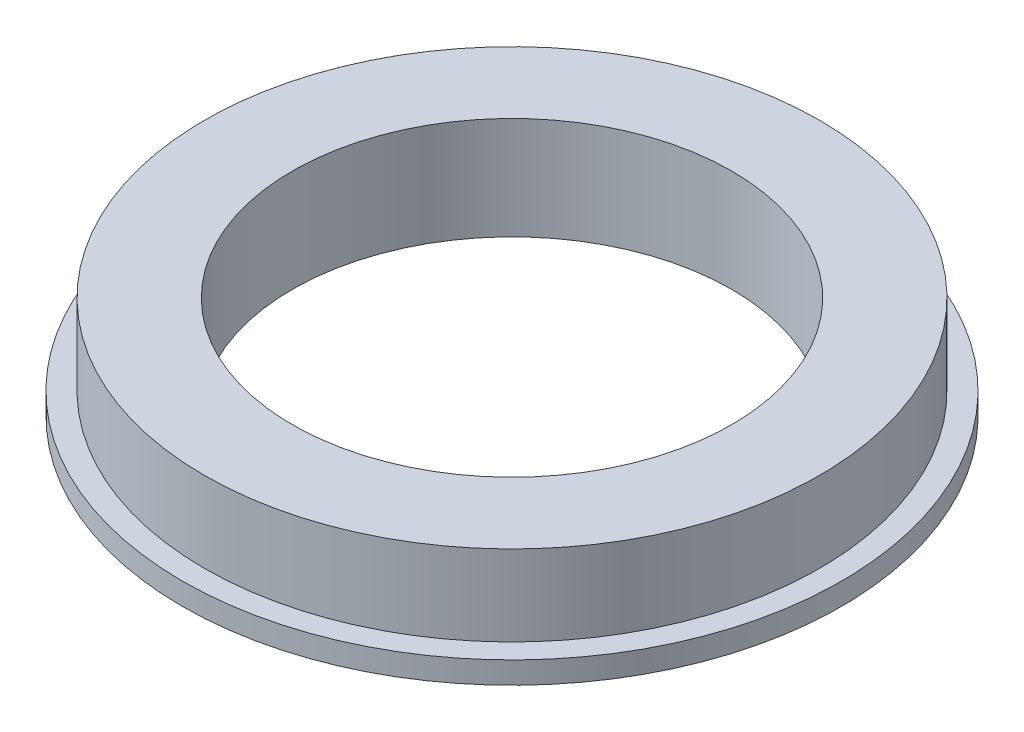
ISO-10303-21;
HEADER;
FILE_DESCRIPTION(('STEP AP214'),'2;1');
FILE_NAME('part.step','',(''),(''),'','','');
FILE_SCHEMA(('AUTOMOTIVE_DESIGN { 1 0 10303 214 1 1 1 1 }'));
ENDSEC;
DATA;
#1=APPLICATION_CONTEXT('core data for automotive mechanical design processes');
#2=APPLICATION_PROTOCOL_DEFINITION('international standard','automotive_design',2000,#1);
#3=PRODUCT_CONTEXT('',#1,'mechanical');
#4=PRODUCT('Part','Part','',(#3));
#5=PRODUCT_RELATED_PRODUCT_CATEGORY('part','',(#4));
#6=PRODUCT_DEFINITION_FORMATION('','',#4);
#7=PRODUCT_DEFINITION_CONTEXT('part definition',#1,'design');
#8=PRODUCT_DEFINITION('design','',#6,#7);
#9=PRODUCT_DEFINITION_SHAPE('','',#8);
#10=(LENGTH_UNIT() NAMED_UNIT(*) SI_UNIT(.MILLI.,.METRE.));
#11=(NAMED_UNIT(*) PLANE_ANGLE_UNIT() SI_UNIT($,.RADIAN.));
#12=(NAMED_UNIT(*) SI_UNIT($,.STERADIAN.) SOLID_ANGLE_UNIT());
#13=UNCERTAINTY_MEASURE_WITH_UNIT(LENGTH_MEASURE(1.E-05),#10,'distance_accuracy_value','');
#14=(GEOMETRIC_REPRESENTATION_CONTEXT(3) GLOBAL_UNCERTAINTY_ASSIGNED_CONTEXT((#13)) GLOBAL_UNIT_ASSIGNED_CONTEXT((#10,
#11,#12)) REPRESENTATION_CONTEXT('',''));
#15=CARTESIAN_POINT('',(0.,0.,0.));
#16=DIRECTION('',(0.,0.,1.));
#17=DIRECTION('',(1.,0.,0.));
#18=AXIS2_PLACEMENT_3D('',#15,#16,#17);
#19=CARTESIAN_POINT('',(-22.5,0.,0.));
#20=DIRECTION('',(0.,1.,0.));
#21=DIRECTION('',(0.,0.,1.));
#22=AXIS2_PLACEMENT_3D('',#19,#20,#21);
#23=PLANE('',#22);
#24=CARTESIAN_POINT('',(0.,0.,0.));
#25=DIRECTION('',(0.,-1.,0.));
#26=DIRECTION('',(0.,0.,-1.));
#27=AXIS2_PLACEMENT_3D('',#24,#25,#26);
#28=CIRCLE('',#27,15.);
#29=CARTESIAN_POINT('',(0.,0.,-15.));
#30=VERTEX_POINT('',#29);
#31=EDGE_CURVE('E10',#30,#30,#28,.T.);
#32=ORIENTED_EDGE('',*,*,#31,.F.);
#33=EDGE_LOOP('',(#32));
#34=FACE_BOUND('',#33,.T.);
#35=CARTESIAN_POINT('',(0.,0.,0.));
#36=DIRECTION('',(0.,-1.,0.));
#37=DIRECTION('',(0.,0.,-1.));
#38=AXIS2_PLACEMENT_3D('',#35,#36,#37);
#39=CIRCLE('',#38,22.5);
#40=CARTESIAN_POINT('',(0.,0.,-22.5));
#41=VERTEX_POINT('',#40);
#42=EDGE_CURVE('E56',#41,#41,#39,.T.);
#43=ORIENTED_EDGE('',*,*,#42,.T.);
#44=EDGE_LOOP('',(#43));
#45=FACE_BOUND('',#44,.T.);
#46=ADVANCED_FACE('F34',(#34,#45),#23,.F.);
#47=CARTESIAN_POINT('',(0.,0.,0.));
#48=DIRECTION('',(0.,-1.,0.));
#49=DIRECTION('',(0.,0.,-1.));
#50=AXIS2_PLACEMENT_3D('',#47,#48,#49);
#51=CYLINDRICAL_SURFACE('',#50,15.);
#52=CARTESIAN_POINT('',(0.,7.,0.));
#53=DIRECTION('',(0.,-1.,0.));
#54=DIRECTION('',(0.,0.,-1.));
#55=AXIS2_PLACEMENT_3D('',#52,#53,#54);
#56=CIRCLE('',#55,15.);
#57=CARTESIAN_POINT('',(0.,7.,-15.));
#58=VERTEX_POINT('',#57);
#59=EDGE_CURVE('E40',#58,#58,#56,.T.);
#60=ORIENTED_EDGE('',*,*,#59,.F.);
#61=EDGE_LOOP('',(#60));
#62=FACE_BOUND('',#61,.T.);
#63=ORIENTED_EDGE('',*,*,#31,.T.);
#64=EDGE_LOOP('',(#63));
#65=FACE_BOUND('',#64,.T.);
#66=ADVANCED_FACE('F81',(#62,#65),#51,.F.);
#67=CARTESIAN_POINT('',(-15.,7.,0.));
#68=DIRECTION('',(0.,-1.,0.));
#69=DIRECTION('',(0.,0.,-1.));
#70=AXIS2_PLACEMENT_3D('',#67,#68,#69);
#71=PLANE('',#70);
#72=CARTESIAN_POINT('',(0.,7.,0.));
#73=DIRECTION('',(0.,-1.,0.));
#74=DIRECTION('',(0.,0.,-1.));
#75=AXIS2_PLACEMENT_3D('',#72,#73,#74);
#76=CIRCLE('',#75,21.);
#77=CARTESIAN_POINT('',(0.,7.,-21.));
#78=VERTEX_POINT('',#77);
#79=EDGE_CURVE('E44',#78,#78,#76,.T.);
#80=ORIENTED_EDGE('',*,*,#79,.F.);
#81=EDGE_LOOP('',(#80));
#82=FACE_BOUND('',#81,.T.);
#83=ORIENTED_EDGE('',*,*,#59,.T.);
#84=EDGE_LOOP('',(#83));
#85=FACE_BOUND('',#84,.T.);
#86=ADVANCED_FACE('F76',(#82,#85),#71,.F.);
#87=CARTESIAN_POINT('',(0.,0.,0.));
#88=DIRECTION('',(0.,-1.,0.));
#89=DIRECTION('',(0.,0.,-1.));
#90=AXIS2_PLACEMENT_3D('',#87,#88,#89);
#91=CYLINDRICAL_SURFACE('',#90,21.);
#92=CARTESIAN_POINT('',(0.,1.5,0.));
#93=DIRECTION('',(0.,-1.,0.));
#94=DIRECTION('',(0.,0.,-1.));
#95=AXIS2_PLACEMENT_3D('',#92,#93,#94);
#96=CIRCLE('',#95,21.);
#97=CARTESIAN_POINT('',(0.,1.5,-21.));
#98=VERTEX_POINT('',#97);
#99=EDGE_CURVE('E48',#98,#98,#96,.T.);
#100=ORIENTED_EDGE('',*,*,#99,.F.);
#101=EDGE_LOOP('',(#100));
#102=FACE_BOUND('',#101,.T.);
#103=ORIENTED_EDGE('',*,*,#79,.T.);
#104=EDGE_LOOP('',(#103));
#105=FACE_BOUND('',#104,.T.);
#106=ADVANCED_FACE('F70',(#102,#105),#91,.T.);
#107=CARTESIAN_POINT('',(-21.,1.5,0.));
#108=DIRECTION('',(0.,-1.,0.));
#109=DIRECTION('',(0.,0.,-1.));
#110=AXIS2_PLACEMENT_3D('',#107,#108,#109);
#111=PLANE('',#110);
#112=CARTESIAN_POINT('',(0.,1.5,0.));
#113=DIRECTION('',(0.,-1.,0.));
#114=DIRECTION('',(0.,0.,-1.));
#115=AXIS2_PLACEMENT_3D('',#112,#113,#114);
#116=CIRCLE('',#115,22.5);
#117=CARTESIAN_POINT('',(0.,1.5,-22.5));
#118=VERTEX_POINT('',#117);
#119=EDGE_CURVE('E53',#118,#118,#116,.T.);
#120=ORIENTED_EDGE('',*,*,#119,.F.);
#121=EDGE_LOOP('',(#120));
#122=FACE_BOUND('',#121,.T.);
#123=ORIENTED_EDGE('',*,*,#99,.T.);
#124=EDGE_LOOP('',(#123));
#125=FACE_BOUND('',#124,.T.);
#126=ADVANCED_FACE('F64',(#122,#125),#111,.F.);
#127=CARTESIAN_POINT('',(0.,0.,0.));
#128=DIRECTION('',(0.,-1.,0.));
#129=DIRECTION('',(0.,0.,-1.));
#130=AXIS2_PLACEMENT_3D('',#127,#128,#129);
#131=CYLINDRICAL_SURFACE('',#130,22.5);
#132=ORIENTED_EDGE('',*,*,#42,.F.);
#133=EDGE_LOOP('',(#132));
#134=FACE_BOUND('',#133,.T.);
#135=ORIENTED_EDGE('',*,*,#119,.T.);
#136=EDGE_LOOP('',(#135));
#137=FACE_BOUND('',#136,.T.);
#138=ADVANCED_FACE('F61',(#134,#137),#131,.T.);
#139=CLOSED_SHELL('',(#46,#66,#86,#106,#126,#138));
#140=MANIFOLD_SOLID_BREP('B2',#139);
#141=ADVANCED_BREP_SHAPE_REPRESENTATION('',(#18,#140),#14);
#142=SHAPE_DEFINITION_REPRESENTATION(#9,#141);
ENDSEC;
END-ISO-10303-21;
